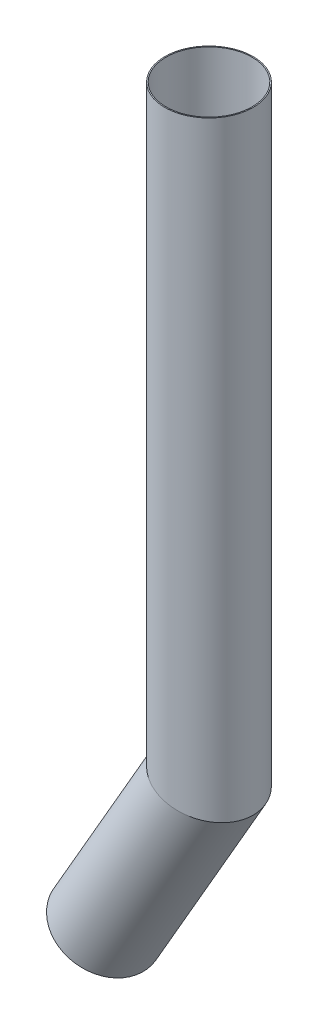
ISO-10303-21;
HEADER;
FILE_DESCRIPTION(('STEP AP214'),'2;1');
FILE_NAME('part.step','',(''),(''),'','','');
FILE_SCHEMA(('AUTOMOTIVE_DESIGN { 1 0 10303 214 1 1 1 1 }'));
ENDSEC;
DATA;
#1=APPLICATION_CONTEXT('core data for automotive mechanical design processes');
#2=APPLICATION_PROTOCOL_DEFINITION('international standard','automotive_design',2000,#1);
#3=PRODUCT_CONTEXT('',#1,'mechanical');
#4=PRODUCT('Part','Part','',(#3));
#5=PRODUCT_RELATED_PRODUCT_CATEGORY('part','',(#4));
#6=PRODUCT_DEFINITION_FORMATION('','',#4);
#7=PRODUCT_DEFINITION_CONTEXT('part definition',#1,'design');
#8=PRODUCT_DEFINITION('design','',#6,#7);
#9=PRODUCT_DEFINITION_SHAPE('','',#8);
#10=(LENGTH_UNIT() NAMED_UNIT(*) SI_UNIT(.MILLI.,.METRE.));
#11=(NAMED_UNIT(*) PLANE_ANGLE_UNIT() SI_UNIT($,.RADIAN.));
#12=(NAMED_UNIT(*) SI_UNIT($,.STERADIAN.) SOLID_ANGLE_UNIT());
#13=UNCERTAINTY_MEASURE_WITH_UNIT(LENGTH_MEASURE(1.E-05),#10,'distance_accuracy_value','');
#14=(GEOMETRIC_REPRESENTATION_CONTEXT(3) GLOBAL_UNCERTAINTY_ASSIGNED_CONTEXT((#13)) GLOBAL_UNIT_ASSIGNED_CONTEXT((#10,
#11,#12)) REPRESENTATION_CONTEXT('',''));
#15=CARTESIAN_POINT('',(0.,0.,0.));
#16=DIRECTION('',(0.,0.,1.));
#17=DIRECTION('',(1.,0.,0.));
#18=AXIS2_PLACEMENT_3D('',#15,#16,#17);
#19=CARTESIAN_POINT('',(404.,1516.74852625782,0.));
#20=DIRECTION('',(0.,-1.,0.));
#21=DIRECTION('',(0.,0.,-1.));
#22=AXIS2_PLACEMENT_3D('',#19,#20,#21);
#23=PLANE('',#22);
#24=CARTESIAN_POINT('',(404.,1516.74852625782,0.));
#25=DIRECTION('',(0.,-1.,0.));
#26=DIRECTION('',(0.,0.,-1.));
#27=AXIS2_PLACEMENT_3D('',#24,#25,#26);
#28=CIRCLE('',#27,58.5);
#29=CARTESIAN_POINT('',(404.,1516.74852625782,-58.5));
#30=VERTEX_POINT('',#29);
#31=EDGE_CURVE('E59',#30,#30,#28,.T.);
#32=ORIENTED_EDGE('',*,*,#31,.T.);
#33=EDGE_LOOP('',(#32));
#34=FACE_BOUND('',#33,.T.);
#35=CARTESIAN_POINT('',(404.,1516.74852625782,0.));
#36=DIRECTION('',(0.,-1.,0.));
#37=DIRECTION('',(0.,0.,-1.));
#38=AXIS2_PLACEMENT_3D('',#35,#36,#37);
#39=CIRCLE('',#38,60.);
#40=CARTESIAN_POINT('',(404.,1516.74852625782,-60.));
#41=VERTEX_POINT('',#40);
#42=EDGE_CURVE('E44',#41,#41,#39,.T.);
#43=ORIENTED_EDGE('',*,*,#42,.F.);
#44=EDGE_LOOP('',(#43));
#45=FACE_BOUND('',#44,.T.);
#46=ADVANCED_FACE('F41',(#34,#45),#23,.F.);
#47=CARTESIAN_POINT('',(262.550000000001,454.749939527206,0.));
#48=DIRECTION('',(-0.499999999999997,-0.866025403784441,0.));
#49=DIRECTION('',(0.,0.,-1.));
#50=AXIS2_PLACEMENT_3D('',#47,#48,#49);
#51=PLANE('',#50);
#52=CARTESIAN_POINT('',(262.550000000001,454.749939527206,0.));
#53=DIRECTION('',(-0.499999999999997,-0.866025403784441,0.));
#54=DIRECTION('',(0.866025403784441,-0.499999999999997,0.));
#55=AXIS2_PLACEMENT_3D('',#52,#53,#54);
#56=CIRCLE('',#55,58.5);
#57=CARTESIAN_POINT('',(313.212486121391,425.499939527207,0.));
#58=VERTEX_POINT('',#57);
#59=EDGE_CURVE('E55',#58,#58,#56,.T.);
#60=ORIENTED_EDGE('',*,*,#59,.F.);
#61=EDGE_LOOP('',(#60));
#62=FACE_BOUND('',#61,.T.);
#63=CARTESIAN_POINT('',(262.550000000001,454.749939527206,0.));
#64=DIRECTION('',(-0.499999999999997,-0.866025403784441,0.));
#65=DIRECTION('',(0.,0.,-1.));
#66=AXIS2_PLACEMENT_3D('',#63,#64,#65);
#67=CIRCLE('',#66,60.);
#68=CARTESIAN_POINT('',(262.550000000001,454.749939527206,-60.));
#69=VERTEX_POINT('',#68);
#70=EDGE_CURVE('E48',#69,#69,#67,.T.);
#71=ORIENTED_EDGE('',*,*,#70,.T.);
#72=EDGE_LOOP('',(#71));
#73=FACE_BOUND('',#72,.T.);
#74=ADVANCED_FACE('F67',(#62,#73),#51,.T.);
#75=CARTESIAN_POINT('',(404.,664.279232856917,0.));
#76=DIRECTION('',(0.,1.,0.));
#77=DIRECTION('',(-1.,0.,0.));
#78=AXIS2_PLACEMENT_3D('',#75,#76,#77);
#79=CYLINDRICAL_SURFACE('',#78,60.);
#80=CARTESIAN_POINT('',(404.,699.748526257825,0.));
#81=DIRECTION('',(0.258819045102519,0.965925826289069,0.));
#82=DIRECTION('',(0.965925826289069,-0.258819045102519,0.));
#83=AXIS2_PLACEMENT_3D('',#80,#81,#82);
#84=ELLIPSE('',#83,62.1165708246049,60.);
#85=CARTESIAN_POINT('',(464.,683.671574711957,0.));
#86=VERTEX_POINT('',#85);
#87=EDGE_CURVE('E12',#86,#86,#84,.T.);
#88=ORIENTED_EDGE('',*,*,#87,.T.);
#89=EDGE_LOOP('',(#88));
#90=FACE_BOUND('',#89,.T.);
#91=ORIENTED_EDGE('',*,*,#42,.T.);
#92=EDGE_LOOP('',(#91));
#93=FACE_BOUND('',#92,.T.);
#94=ADVANCED_FACE('F73',(#90,#93),#79,.T.);
#95=CARTESIAN_POINT('',(262.550000000001,454.749939527206,0.));
#96=DIRECTION('',(0.499999999999997,0.866025403784441,0.));
#97=DIRECTION('',(-0.866025403784441,0.499999999999997,0.));
#98=AXIS2_PLACEMENT_3D('',#95,#96,#97);
#99=CYLINDRICAL_SURFACE('',#98,60.);
#100=ORIENTED_EDGE('',*,*,#70,.F.);
#101=EDGE_LOOP('',(#100));
#102=FACE_BOUND('',#101,.T.);
#103=ORIENTED_EDGE('',*,*,#87,.F.);
#104=EDGE_LOOP('',(#103));
#105=FACE_BOUND('',#104,.T.);
#106=ADVANCED_FACE('F69',(#102,#105),#99,.T.);
#107=CARTESIAN_POINT('',(404.,664.279232856917,0.));
#108=DIRECTION('',(0.,1.,0.));
#109=DIRECTION('',(-1.,0.,0.));
#110=AXIS2_PLACEMENT_3D('',#107,#108,#109);
#111=CYLINDRICAL_SURFACE('',#110,58.5);
#112=CARTESIAN_POINT('',(404.,699.748526257825,0.));
#113=DIRECTION('',(0.258819045102519,0.965925826289069,0.));
#114=DIRECTION('',(-0.965925826289069,0.258819045102519,0.));
#115=AXIS2_PLACEMENT_3D('',#112,#113,#114);
#116=ELLIPSE('',#115,60.5636565539898,58.5);
#117=CARTESIAN_POINT('',(404.,699.748526257825,-58.5));
#118=VERTEX_POINT('',#117);
#119=EDGE_CURVE('E52',#118,#118,#116,.T.);
#120=ORIENTED_EDGE('',*,*,#119,.F.);
#121=EDGE_LOOP('',(#120));
#122=FACE_BOUND('',#121,.T.);
#123=ORIENTED_EDGE('',*,*,#31,.F.);
#124=EDGE_LOOP('',(#123));
#125=FACE_BOUND('',#124,.T.);
#126=ADVANCED_FACE('F72',(#122,#125),#111,.F.);
#127=CARTESIAN_POINT('',(262.550000000001,454.749939527206,0.));
#128=DIRECTION('',(0.499999999999997,0.866025403784441,0.));
#129=DIRECTION('',(-0.866025403784441,0.499999999999997,0.));
#130=AXIS2_PLACEMENT_3D('',#127,#128,#129);
#131=CYLINDRICAL_SURFACE('',#130,58.5);
#132=ORIENTED_EDGE('',*,*,#59,.T.);
#133=EDGE_LOOP('',(#132));
#134=FACE_BOUND('',#133,.T.);
#135=ORIENTED_EDGE('',*,*,#119,.T.);
#136=EDGE_LOOP('',(#135));
#137=FACE_BOUND('',#136,.T.);
#138=ADVANCED_FACE('F53',(#134,#137),#131,.F.);
#139=CLOSED_SHELL('',(#46,#74,#94,#106,#126,#138));
#140=MANIFOLD_SOLID_BREP('B2',#139);
#141=ADVANCED_BREP_SHAPE_REPRESENTATION('',(#18,#140),#14);
#142=SHAPE_DEFINITION_REPRESENTATION(#9,#141);
ENDSEC;
END-ISO-10303-21;
